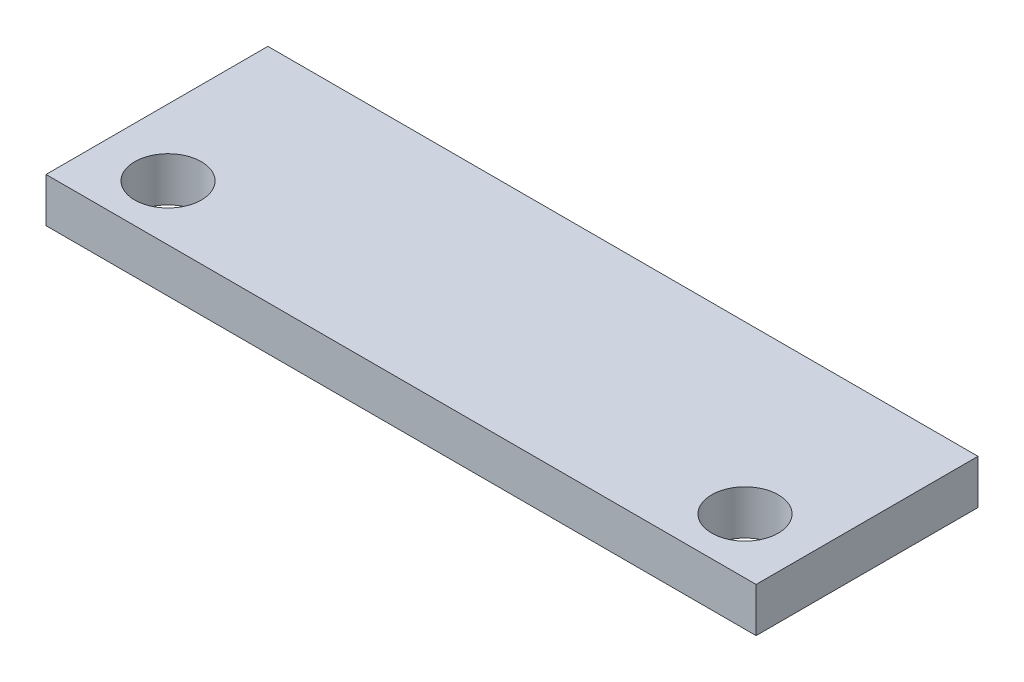
ISO-10303-21;
HEADER;
FILE_DESCRIPTION(('STEP AP214'),'2;1');
FILE_NAME('part.step','',(''),(''),'','','');
FILE_SCHEMA(('AUTOMOTIVE_DESIGN { 1 0 10303 214 1 1 1 1 }'));
ENDSEC;
DATA;
#1=APPLICATION_CONTEXT('core data for automotive mechanical design processes');
#2=APPLICATION_PROTOCOL_DEFINITION('international standard','automotive_design',2000,#1);
#3=PRODUCT_CONTEXT('',#1,'mechanical');
#4=PRODUCT('Part','Part','',(#3));
#5=PRODUCT_RELATED_PRODUCT_CATEGORY('part','',(#4));
#6=PRODUCT_DEFINITION_FORMATION('','',#4);
#7=PRODUCT_DEFINITION_CONTEXT('part definition',#1,'design');
#8=PRODUCT_DEFINITION('design','',#6,#7);
#9=PRODUCT_DEFINITION_SHAPE('','',#8);
#10=(LENGTH_UNIT() NAMED_UNIT(*) SI_UNIT(.MILLI.,.METRE.));
#11=(NAMED_UNIT(*) PLANE_ANGLE_UNIT() SI_UNIT($,.RADIAN.));
#12=(NAMED_UNIT(*) SI_UNIT($,.STERADIAN.) SOLID_ANGLE_UNIT());
#13=UNCERTAINTY_MEASURE_WITH_UNIT(LENGTH_MEASURE(1.E-05),#10,'distance_accuracy_value','');
#14=(GEOMETRIC_REPRESENTATION_CONTEXT(3) GLOBAL_UNCERTAINTY_ASSIGNED_CONTEXT((#13)) GLOBAL_UNIT_ASSIGNED_CONTEXT((#10,
#11,#12)) REPRESENTATION_CONTEXT('',''));
#15=CARTESIAN_POINT('',(0.,0.,0.));
#16=DIRECTION('',(0.,0.,1.));
#17=DIRECTION('',(1.,0.,0.));
#18=AXIS2_PLACEMENT_3D('',#15,#16,#17);
#19=CARTESIAN_POINT('',(0.,2.,0.));
#20=DIRECTION('',(0.,1.,0.));
#21=DIRECTION('',(0.,0.,1.));
#22=AXIS2_PLACEMENT_3D('',#19,#20,#21);
#23=PLANE('',#22);
#24=CARTESIAN_POINT('',(13.,2.,2.5));
#25=DIRECTION('',(0.,1.,0.));
#26=DIRECTION('',(0.,0.,1.));
#27=AXIS2_PLACEMENT_3D('',#24,#25,#26);
#28=CIRCLE('',#27,1.5);
#29=CARTESIAN_POINT('',(13.,2.,4.));
#30=VERTEX_POINT('',#29);
#31=EDGE_CURVE('E104',#30,#30,#28,.T.);
#32=ORIENTED_EDGE('',*,*,#31,.F.);
#33=EDGE_LOOP('',(#32));
#34=FACE_BOUND('',#33,.T.);
#35=DIRECTION('',(0.,0.,-1.));
#36=VECTOR('',#35,1.);
#37=CARTESIAN_POINT('',(16.,2.,-5.));
#38=LINE('',#37,#36);
#39=CARTESIAN_POINT('',(16.,2.,5.));
#40=VERTEX_POINT('',#39);
#41=CARTESIAN_POINT('',(16.,2.,-5.));
#42=VERTEX_POINT('',#41);
#43=EDGE_CURVE('E89',#40,#42,#38,.T.);
#44=ORIENTED_EDGE('',*,*,#43,.T.);
#45=DIRECTION('',(-1.,0.,0.));
#46=VECTOR('',#45,1.);
#47=CARTESIAN_POINT('',(-16.,2.,-5.));
#48=LINE('',#47,#46);
#49=CARTESIAN_POINT('',(-16.,2.,-5.));
#50=VERTEX_POINT('',#49);
#51=EDGE_CURVE('E84',#42,#50,#48,.T.);
#52=ORIENTED_EDGE('',*,*,#51,.T.);
#53=DIRECTION('',(0.,0.,1.));
#54=VECTOR('',#53,1.);
#55=CARTESIAN_POINT('',(-16.,2.,-5.));
#56=LINE('',#55,#54);
#57=CARTESIAN_POINT('',(-16.,2.,5.));
#58=VERTEX_POINT('',#57);
#59=EDGE_CURVE('E87',#50,#58,#56,.T.);
#60=ORIENTED_EDGE('',*,*,#59,.T.);
#61=DIRECTION('',(1.,0.,0.));
#62=VECTOR('',#61,1.);
#63=CARTESIAN_POINT('',(-16.,2.,5.));
#64=LINE('',#63,#62);
#65=EDGE_CURVE('E54',#58,#40,#64,.T.);
#66=ORIENTED_EDGE('',*,*,#65,.T.);
#67=EDGE_LOOP('',(#44,#52,#60,#66));
#68=FACE_BOUND('',#67,.T.);
#69=CARTESIAN_POINT('',(-13.,2.,2.5));
#70=DIRECTION('',(0.,1.,0.));
#71=DIRECTION('',(0.,0.,1.));
#72=AXIS2_PLACEMENT_3D('',#69,#70,#71);
#73=CIRCLE('',#72,1.5);
#74=CARTESIAN_POINT('',(-13.,2.,4.));
#75=VERTEX_POINT('',#74);
#76=EDGE_CURVE('E119',#75,#75,#73,.T.);
#77=ORIENTED_EDGE('',*,*,#76,.F.);
#78=EDGE_LOOP('',(#77));
#79=FACE_BOUND('',#78,.T.);
#80=ADVANCED_FACE('F37',(#34,#68,#79),#23,.T.);
#81=CARTESIAN_POINT('',(0.,0.,0.));
#82=DIRECTION('',(0.,1.,0.));
#83=DIRECTION('',(0.,0.,1.));
#84=AXIS2_PLACEMENT_3D('',#81,#82,#83);
#85=PLANE('',#84);
#86=DIRECTION('',(0.,0.,-1.));
#87=VECTOR('',#86,1.);
#88=CARTESIAN_POINT('',(16.,0.,-5.));
#89=LINE('',#88,#87);
#90=CARTESIAN_POINT('',(16.,0.,5.));
#91=VERTEX_POINT('',#90);
#92=CARTESIAN_POINT('',(16.,0.,-5.));
#93=VERTEX_POINT('',#92);
#94=EDGE_CURVE('E101',#91,#93,#89,.T.);
#95=ORIENTED_EDGE('',*,*,#94,.F.);
#96=DIRECTION('',(1.,0.,0.));
#97=VECTOR('',#96,1.);
#98=CARTESIAN_POINT('',(-16.,0.,5.));
#99=LINE('',#98,#97);
#100=CARTESIAN_POINT('',(-16.,0.,5.));
#101=VERTEX_POINT('',#100);
#102=EDGE_CURVE('E77',#101,#91,#99,.T.);
#103=ORIENTED_EDGE('',*,*,#102,.F.);
#104=DIRECTION('',(0.,0.,1.));
#105=VECTOR('',#104,1.);
#106=CARTESIAN_POINT('',(-16.,0.,-5.));
#107=LINE('',#106,#105);
#108=CARTESIAN_POINT('',(-16.,0.,-5.));
#109=VERTEX_POINT('',#108);
#110=EDGE_CURVE('E71',#109,#101,#107,.T.);
#111=ORIENTED_EDGE('',*,*,#110,.F.);
#112=DIRECTION('',(-1.,0.,0.));
#113=VECTOR('',#112,1.);
#114=CARTESIAN_POINT('',(-16.,0.,-5.));
#115=LINE('',#114,#113);
#116=EDGE_CURVE('E93',#93,#109,#115,.T.);
#117=ORIENTED_EDGE('',*,*,#116,.F.);
#118=EDGE_LOOP('',(#95,#103,#111,#117));
#119=FACE_BOUND('',#118,.T.);
#120=CARTESIAN_POINT('',(13.,0.,2.5));
#121=DIRECTION('',(0.,1.,0.));
#122=DIRECTION('',(0.,0.,1.));
#123=AXIS2_PLACEMENT_3D('',#120,#121,#122);
#124=CIRCLE('',#123,1.5);
#125=CARTESIAN_POINT('',(13.,0.,4.));
#126=VERTEX_POINT('',#125);
#127=EDGE_CURVE('E116',#126,#126,#124,.T.);
#128=ORIENTED_EDGE('',*,*,#127,.T.);
#129=EDGE_LOOP('',(#128));
#130=FACE_BOUND('',#129,.T.);
#131=CARTESIAN_POINT('',(-13.,0.,2.5));
#132=DIRECTION('',(0.,1.,0.));
#133=DIRECTION('',(0.,0.,1.));
#134=AXIS2_PLACEMENT_3D('',#131,#132,#133);
#135=CIRCLE('',#134,1.5);
#136=CARTESIAN_POINT('',(-13.,0.,4.));
#137=VERTEX_POINT('',#136);
#138=EDGE_CURVE('E122',#137,#137,#135,.T.);
#139=ORIENTED_EDGE('',*,*,#138,.T.);
#140=EDGE_LOOP('',(#139));
#141=FACE_BOUND('',#140,.T.);
#142=ADVANCED_FACE('F112',(#119,#130,#141),#85,.F.);
#143=CARTESIAN_POINT('',(16.,2.,-5.));
#144=DIRECTION('',(-1.,0.,0.));
#145=DIRECTION('',(0.,0.,1.));
#146=AXIS2_PLACEMENT_3D('',#143,#144,#145);
#147=PLANE('',#146);
#148=ORIENTED_EDGE('',*,*,#94,.T.);
#149=DIRECTION('',(0.,-1.,0.));
#150=VECTOR('',#149,1.);
#151=CARTESIAN_POINT('',(16.,2.,-5.));
#152=LINE('',#151,#150);
#153=EDGE_CURVE('E11',#42,#93,#152,.T.);
#154=ORIENTED_EDGE('',*,*,#153,.F.);
#155=ORIENTED_EDGE('',*,*,#43,.F.);
#156=DIRECTION('',(0.,-1.,0.));
#157=VECTOR('',#156,1.);
#158=CARTESIAN_POINT('',(16.,2.,5.));
#159=LINE('',#158,#157);
#160=EDGE_CURVE('E97',#40,#91,#159,.T.);
#161=ORIENTED_EDGE('',*,*,#160,.T.);
#162=EDGE_LOOP('',(#148,#154,#155,#161));
#163=FACE_BOUND('',#162,.T.);
#164=ADVANCED_FACE('F39',(#163),#147,.F.);
#165=CARTESIAN_POINT('',(-16.,2.,-5.));
#166=DIRECTION('',(0.,0.,1.));
#167=DIRECTION('',(1.,0.,0.));
#168=AXIS2_PLACEMENT_3D('',#165,#166,#167);
#169=PLANE('',#168);
#170=ORIENTED_EDGE('',*,*,#116,.T.);
#171=DIRECTION('',(0.,-1.,0.));
#172=VECTOR('',#171,1.);
#173=CARTESIAN_POINT('',(-16.,2.,-5.));
#174=LINE('',#173,#172);
#175=EDGE_CURVE('E46',#50,#109,#174,.T.);
#176=ORIENTED_EDGE('',*,*,#175,.F.);
#177=ORIENTED_EDGE('',*,*,#51,.F.);
#178=ORIENTED_EDGE('',*,*,#153,.T.);
#179=EDGE_LOOP('',(#170,#176,#177,#178));
#180=FACE_BOUND('',#179,.T.);
#181=ADVANCED_FACE('F92',(#180),#169,.F.);
#182=CARTESIAN_POINT('',(-16.,2.,-5.));
#183=DIRECTION('',(1.,0.,0.));
#184=DIRECTION('',(0.,0.,-1.));
#185=AXIS2_PLACEMENT_3D('',#182,#183,#184);
#186=PLANE('',#185);
#187=ORIENTED_EDGE('',*,*,#110,.T.);
#188=DIRECTION('',(0.,-1.,0.));
#189=VECTOR('',#188,1.);
#190=CARTESIAN_POINT('',(-16.,2.,5.));
#191=LINE('',#190,#189);
#192=EDGE_CURVE('E94',#58,#101,#191,.T.);
#193=ORIENTED_EDGE('',*,*,#192,.F.);
#194=ORIENTED_EDGE('',*,*,#59,.F.);
#195=ORIENTED_EDGE('',*,*,#175,.T.);
#196=EDGE_LOOP('',(#187,#193,#194,#195));
#197=FACE_BOUND('',#196,.T.);
#198=ADVANCED_FACE('F95',(#197),#186,.F.);
#199=CARTESIAN_POINT('',(-16.,2.,5.));
#200=DIRECTION('',(0.,0.,-1.));
#201=DIRECTION('',(-1.,0.,0.));
#202=AXIS2_PLACEMENT_3D('',#199,#200,#201);
#203=PLANE('',#202);
#204=ORIENTED_EDGE('',*,*,#102,.T.);
#205=ORIENTED_EDGE('',*,*,#160,.F.);
#206=ORIENTED_EDGE('',*,*,#65,.F.);
#207=ORIENTED_EDGE('',*,*,#192,.T.);
#208=EDGE_LOOP('',(#204,#205,#206,#207));
#209=FACE_BOUND('',#208,.T.);
#210=ADVANCED_FACE('F109',(#209),#203,.F.);
#211=CARTESIAN_POINT('',(13.,2.,2.5));
#212=DIRECTION('',(0.,-1.,0.));
#213=DIRECTION('',(0.,0.,-1.));
#214=AXIS2_PLACEMENT_3D('',#211,#212,#213);
#215=CYLINDRICAL_SURFACE('',#214,1.5);
#216=ORIENTED_EDGE('',*,*,#31,.T.);
#217=EDGE_LOOP('',(#216));
#218=FACE_BOUND('',#217,.T.);
#219=ORIENTED_EDGE('',*,*,#127,.F.);
#220=EDGE_LOOP('',(#219));
#221=FACE_BOUND('',#220,.T.);
#222=ADVANCED_FACE('F139',(#218,#221),#215,.F.);
#223=CARTESIAN_POINT('',(-13.,2.,2.5));
#224=DIRECTION('',(0.,-1.,0.));
#225=DIRECTION('',(0.,0.,-1.));
#226=AXIS2_PLACEMENT_3D('',#223,#224,#225);
#227=CYLINDRICAL_SURFACE('',#226,1.5);
#228=ORIENTED_EDGE('',*,*,#76,.T.);
#229=EDGE_LOOP('',(#228));
#230=FACE_BOUND('',#229,.T.);
#231=ORIENTED_EDGE('',*,*,#138,.F.);
#232=EDGE_LOOP('',(#231));
#233=FACE_BOUND('',#232,.T.);
#234=ADVANCED_FACE('F128',(#230,#233),#227,.F.);
#235=CLOSED_SHELL('',(#80,#142,#164,#181,#198,#210,#222,#234));
#236=MANIFOLD_SOLID_BREP('B2',#235);
#237=ADVANCED_BREP_SHAPE_REPRESENTATION('',(#18,#236),#14);
#238=SHAPE_DEFINITION_REPRESENTATION(#9,#237);
ENDSEC;
END-ISO-10303-21;
